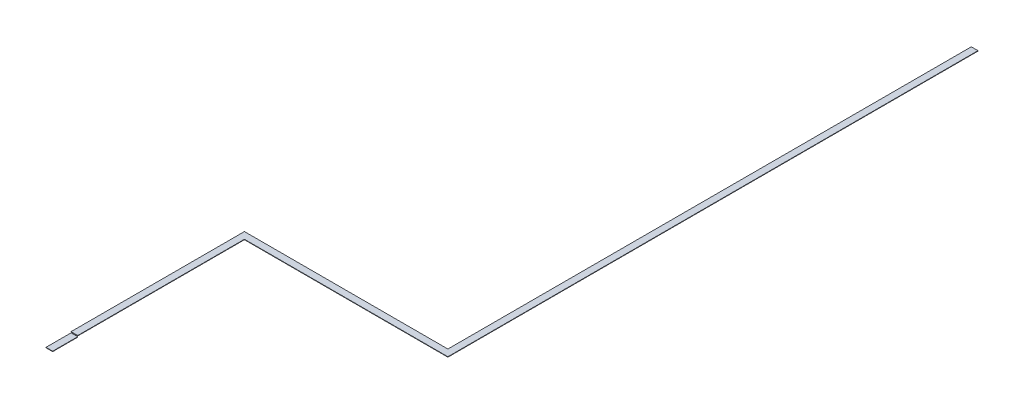
ISO-10303-21;
HEADER;
FILE_DESCRIPTION(('STEP AP214'),'2;1');
FILE_NAME('part.step','',(''),(''),'','','');
FILE_SCHEMA(('AUTOMOTIVE_DESIGN { 1 0 10303 214 1 1 1 1 }'));
ENDSEC;
DATA;
#1=APPLICATION_CONTEXT('core data for automotive mechanical design processes');
#2=APPLICATION_PROTOCOL_DEFINITION('international standard','automotive_design',2000,#1);
#3=PRODUCT_CONTEXT('',#1,'mechanical');
#4=PRODUCT('Part','Part','',(#3));
#5=PRODUCT_RELATED_PRODUCT_CATEGORY('part','',(#4));
#6=PRODUCT_DEFINITION_FORMATION('','',#4);
#7=PRODUCT_DEFINITION_CONTEXT('part definition',#1,'design');
#8=PRODUCT_DEFINITION('design','',#6,#7);
#9=PRODUCT_DEFINITION_SHAPE('','',#8);
#10=(LENGTH_UNIT() NAMED_UNIT(*) SI_UNIT(.MILLI.,.METRE.));
#11=(NAMED_UNIT(*) PLANE_ANGLE_UNIT() SI_UNIT($,.RADIAN.));
#12=(NAMED_UNIT(*) SI_UNIT($,.STERADIAN.) SOLID_ANGLE_UNIT());
#13=UNCERTAINTY_MEASURE_WITH_UNIT(LENGTH_MEASURE(1.E-05),#10,'distance_accuracy_value','');
#14=(GEOMETRIC_REPRESENTATION_CONTEXT(3) GLOBAL_UNCERTAINTY_ASSIGNED_CONTEXT((#13)) GLOBAL_UNIT_ASSIGNED_CONTEXT((#10,
#11,#12)) REPRESENTATION_CONTEXT('',''));
#15=CARTESIAN_POINT('',(0.,0.,0.));
#16=DIRECTION('',(0.,0.,1.));
#17=DIRECTION('',(1.,0.,0.));
#18=AXIS2_PLACEMENT_3D('',#15,#16,#17);
#19=CARTESIAN_POINT('',(0.,-7.9375,0.));
#20=DIRECTION('',(1.,0.,0.));
#21=DIRECTION('',(0.,0.,-1.));
#22=AXIS2_PLACEMENT_3D('',#19,#20,#21);
#23=PLANE('',#22);
#24=DIRECTION('',(0.,0.,-1.));
#25=VECTOR('',#24,1.);
#26=CARTESIAN_POINT('',(0.,-4.7625,0.));
#27=LINE('',#26,#25);
#28=CARTESIAN_POINT('',(0.,-4.7625,0.));
#29=VERTEX_POINT('',#28);
#30=CARTESIAN_POINT('',(0.,-4.7625,-190.5));
#31=VERTEX_POINT('',#30);
#32=EDGE_CURVE('E106',#29,#31,#27,.T.);
#33=ORIENTED_EDGE('',*,*,#32,.T.);
#34=DIRECTION('',(0.,1.,0.));
#35=VECTOR('',#34,1.);
#36=CARTESIAN_POINT('',(0.,-7.9375,-190.5));
#37=LINE('',#36,#35);
#38=CARTESIAN_POINT('',(0.,-7.9375,-190.5));
#39=VERTEX_POINT('',#38);
#40=EDGE_CURVE('E12',#39,#31,#37,.T.);
#41=ORIENTED_EDGE('',*,*,#40,.F.);
#42=DIRECTION('',(0.,0.,-1.));
#43=VECTOR('',#42,1.);
#44=CARTESIAN_POINT('',(0.,-7.9375,0.));
#45=LINE('',#44,#43);
#46=CARTESIAN_POINT('',(0.,-7.9375,0.));
#47=VERTEX_POINT('',#46);
#48=EDGE_CURVE('E94',#47,#39,#45,.T.);
#49=ORIENTED_EDGE('',*,*,#48,.F.);
#50=DIRECTION('',(0.,1.,0.));
#51=VECTOR('',#50,1.);
#52=CARTESIAN_POINT('',(0.,-7.9375,0.));
#53=LINE('',#52,#51);
#54=EDGE_CURVE('E102',#47,#29,#53,.T.);
#55=ORIENTED_EDGE('',*,*,#54,.T.);
#56=EDGE_LOOP('',(#33,#41,#49,#55));
#57=FACE_BOUND('',#56,.T.);
#58=ADVANCED_FACE('F43',(#57),#23,.F.);
#59=CARTESIAN_POINT('',(0.,-7.9375,-190.5));
#60=DIRECTION('',(0.,0.,1.));
#61=DIRECTION('',(1.,0.,0.));
#62=AXIS2_PLACEMENT_3D('',#59,#60,#61);
#63=PLANE('',#62);
#64=DIRECTION('',(1.,0.,0.));
#65=VECTOR('',#64,1.);
#66=CARTESIAN_POINT('',(0.,-4.7625,-190.5));
#67=LINE('',#66,#65);
#68=CARTESIAN_POINT('',(50.8000000000002,-4.7625,-190.5));
#69=VERTEX_POINT('',#68);
#70=EDGE_CURVE('E98',#31,#69,#67,.T.);
#71=ORIENTED_EDGE('',*,*,#70,.T.);
#72=DIRECTION('',(0.,1.,0.));
#73=VECTOR('',#72,1.);
#74=CARTESIAN_POINT('',(50.8000000000002,-7.9375,-190.5));
#75=LINE('',#74,#73);
#76=CARTESIAN_POINT('',(50.8000000000002,-7.9375,-190.5));
#77=VERTEX_POINT('',#76);
#78=EDGE_CURVE('E51',#77,#69,#75,.T.);
#79=ORIENTED_EDGE('',*,*,#78,.F.);
#80=DIRECTION('',(1.,0.,0.));
#81=VECTOR('',#80,1.);
#82=CARTESIAN_POINT('',(0.,-7.9375,-190.5));
#83=LINE('',#82,#81);
#84=EDGE_CURVE('E89',#39,#77,#83,.T.);
#85=ORIENTED_EDGE('',*,*,#84,.F.);
#86=ORIENTED_EDGE('',*,*,#40,.T.);
#87=EDGE_LOOP('',(#71,#79,#85,#86));
#88=FACE_BOUND('',#87,.T.);
#89=ADVANCED_FACE('F97',(#88),#63,.F.);
#90=CARTESIAN_POINT('',(50.8000000000002,-7.9375,0.));
#91=DIRECTION('',(-1.,0.,0.));
#92=DIRECTION('',(0.,0.,1.));
#93=AXIS2_PLACEMENT_3D('',#90,#91,#92);
#94=PLANE('',#93);
#95=DIRECTION('',(0.,0.,1.));
#96=VECTOR('',#95,1.);
#97=CARTESIAN_POINT('',(50.8000000000002,-4.7625,0.));
#98=LINE('',#97,#96);
#99=CARTESIAN_POINT('',(50.8000000000002,-4.7625,0.));
#100=VERTEX_POINT('',#99);
#101=EDGE_CURVE('E76',#69,#100,#98,.T.);
#102=ORIENTED_EDGE('',*,*,#101,.T.);
#103=DIRECTION('',(0.,1.,0.));
#104=VECTOR('',#103,1.);
#105=CARTESIAN_POINT('',(50.8000000000002,-7.9375,0.));
#106=LINE('',#105,#104);
#107=CARTESIAN_POINT('',(50.8000000000002,-7.9375,0.));
#108=VERTEX_POINT('',#107);
#109=EDGE_CURVE('E99',#108,#100,#106,.T.);
#110=ORIENTED_EDGE('',*,*,#109,.F.);
#111=DIRECTION('',(0.,0.,1.));
#112=VECTOR('',#111,1.);
#113=CARTESIAN_POINT('',(50.8000000000002,-7.9375,0.));
#114=LINE('',#113,#112);
#115=EDGE_CURVE('E92',#77,#108,#114,.T.);
#116=ORIENTED_EDGE('',*,*,#115,.F.);
#117=ORIENTED_EDGE('',*,*,#78,.T.);
#118=EDGE_LOOP('',(#102,#110,#116,#117));
#119=FACE_BOUND('',#118,.T.);
#120=ADVANCED_FACE('F100',(#119),#94,.F.);
#121=CARTESIAN_POINT('',(0.,-7.9375,0.));
#122=DIRECTION('',(0.,0.,-1.));
#123=DIRECTION('',(-1.,0.,0.));
#124=AXIS2_PLACEMENT_3D('',#121,#122,#123);
#125=PLANE('',#124);
#126=DIRECTION('',(-1.,0.,0.));
#127=VECTOR('',#126,1.);
#128=CARTESIAN_POINT('',(0.,-4.7625,0.));
#129=LINE('',#128,#127);
#130=EDGE_CURVE('E82',#100,#29,#129,.T.);
#131=ORIENTED_EDGE('',*,*,#130,.T.);
#132=ORIENTED_EDGE('',*,*,#54,.F.);
#133=DIRECTION('',(-1.,0.,0.));
#134=VECTOR('',#133,1.);
#135=CARTESIAN_POINT('',(0.,-7.9375,0.));
#136=LINE('',#135,#134);
#137=EDGE_CURVE('E59',#108,#47,#136,.T.);
#138=ORIENTED_EDGE('',*,*,#137,.F.);
#139=ORIENTED_EDGE('',*,*,#109,.T.);
#140=EDGE_LOOP('',(#131,#132,#138,#139));
#141=FACE_BOUND('',#140,.T.);
#142=ADVANCED_FACE('F113',(#141),#125,.F.);
#143=CARTESIAN_POINT('',(0.,-7.9375,0.));
#144=DIRECTION('',(0.,-1.,0.));
#145=DIRECTION('',(0.,0.,-1.));
#146=AXIS2_PLACEMENT_3D('',#143,#144,#145);
#147=PLANE('',#146);
#148=ORIENTED_EDGE('',*,*,#48,.T.);
#149=ORIENTED_EDGE('',*,*,#84,.T.);
#150=ORIENTED_EDGE('',*,*,#115,.T.);
#151=ORIENTED_EDGE('',*,*,#137,.T.);
#152=EDGE_LOOP('',(#148,#149,#150,#151));
#153=FACE_BOUND('',#152,.T.);
#154=ADVANCED_FACE('F90',(#153),#147,.T.);
#155=CARTESIAN_POINT('',(0.,-4.7625,0.));
#156=DIRECTION('',(0.,-1.,0.));
#157=DIRECTION('',(0.,0.,-1.));
#158=AXIS2_PLACEMENT_3D('',#155,#156,#157);
#159=PLANE('',#158);
#160=ORIENTED_EDGE('',*,*,#32,.F.);
#161=ORIENTED_EDGE('',*,*,#130,.F.);
#162=ORIENTED_EDGE('',*,*,#101,.F.);
#163=ORIENTED_EDGE('',*,*,#70,.F.);
#164=EDGE_LOOP('',(#160,#161,#162,#163));
#165=FACE_BOUND('',#164,.T.);
#166=ADVANCED_FACE('F116',(#165),#159,.F.);
#167=CLOSED_SHELL('',(#58,#89,#120,#142,#154,#166));
#168=MANIFOLD_SOLID_BREP('B2',#167);
#169=CARTESIAN_POINT('',(50.8,3.175,-1457.325));
#170=DIRECTION('',(-1.,0.,0.));
#171=DIRECTION('',(0.,0.,1.));
#172=AXIS2_PLACEMENT_3D('',#169,#170,#171);
#173=PLANE('',#172);
#174=DIRECTION('',(0.,0.,-1.));
#175=VECTOR('',#174,1.);
#176=CARTESIAN_POINT('',(50.8,3.175,-1457.325));
#177=LINE('',#176,#175);
#178=CARTESIAN_POINT('',(50.8000000000002,3.175,-190.5));
#179=VERTEX_POINT('',#178);
#180=CARTESIAN_POINT('',(50.8,3.175,-1457.325));
#181=VERTEX_POINT('',#180);
#182=EDGE_CURVE('E225',#179,#181,#177,.T.);
#183=ORIENTED_EDGE('',*,*,#182,.F.);
#184=DIRECTION('',(0.,1.,0.));
#185=VECTOR('',#184,1.);
#186=CARTESIAN_POINT('',(50.8000000000002,0.,-190.5));
#187=LINE('',#186,#185);
#188=CARTESIAN_POINT('',(50.8000000000002,0.,-190.5));
#189=VERTEX_POINT('',#188);
#190=EDGE_CURVE('E301',#189,#179,#187,.T.);
#191=ORIENTED_EDGE('',*,*,#190,.F.);
#192=DIRECTION('',(0.,0.,-1.));
#193=VECTOR('',#192,1.);
#194=CARTESIAN_POINT('',(50.8,0.,-1457.325));
#195=LINE('',#194,#193);
#196=CARTESIAN_POINT('',(50.8,0.,-1457.325));
#197=VERTEX_POINT('',#196);
#198=EDGE_CURVE('E266',#189,#197,#195,.T.);
#199=ORIENTED_EDGE('',*,*,#198,.T.);
#200=DIRECTION('',(0.,-1.,0.));
#201=VECTOR('',#200,1.);
#202=CARTESIAN_POINT('',(50.8,3.175,-1457.325));
#203=LINE('',#202,#201);
#204=EDGE_CURVE('E41',#181,#197,#203,.T.);
#205=ORIENTED_EDGE('',*,*,#204,.F.);
#206=EDGE_LOOP('',(#183,#191,#199,#205));
#207=FACE_BOUND('',#206,.T.);
#208=ADVANCED_FACE('F167',(#207),#173,.F.);
#209=CARTESIAN_POINT('',(1597.025,3.175,-1457.325));
#210=DIRECTION('',(0.,0.,-1.));
#211=DIRECTION('',(-1.,0.,0.));
#212=AXIS2_PLACEMENT_3D('',#209,#210,#211);
#213=PLANE('',#212);
#214=DIRECTION('',(1.,0.,0.));
#215=VECTOR('',#214,1.);
#216=CARTESIAN_POINT('',(1597.025,0.,-1457.325));
#217=LINE('',#216,#215);
#218=CARTESIAN_POINT('',(1597.025,0.,-1457.325));
#219=VERTEX_POINT('',#218);
#220=EDGE_CURVE('E268',#197,#219,#217,.T.);
#221=ORIENTED_EDGE('',*,*,#220,.T.);
#222=DIRECTION('',(0.,-1.,0.));
#223=VECTOR('',#222,1.);
#224=CARTESIAN_POINT('',(1597.025,3.175,-1457.325));
#225=LINE('',#224,#223);
#226=CARTESIAN_POINT('',(1597.025,3.175,-1457.325));
#227=VERTEX_POINT('',#226);
#228=EDGE_CURVE('E174',#227,#219,#225,.T.);
#229=ORIENTED_EDGE('',*,*,#228,.F.);
#230=DIRECTION('',(1.,0.,0.));
#231=VECTOR('',#230,1.);
#232=CARTESIAN_POINT('',(1597.025,3.175,-1457.325));
#233=LINE('',#232,#231);
#234=EDGE_CURVE('E311',#181,#227,#233,.T.);
#235=ORIENTED_EDGE('',*,*,#234,.F.);
#236=ORIENTED_EDGE('',*,*,#204,.T.);
#237=EDGE_LOOP('',(#221,#229,#235,#236));
#238=FACE_BOUND('',#237,.T.);
#239=ADVANCED_FACE('F313',(#238),#213,.F.);
#240=CARTESIAN_POINT('',(1597.025,3.175,-5486.39999999999));
#241=DIRECTION('',(-1.,0.,0.));
#242=DIRECTION('',(0.,0.,1.));
#243=AXIS2_PLACEMENT_3D('',#240,#241,#242);
#244=PLANE('',#243);
#245=DIRECTION('',(0.,0.,-1.));
#246=VECTOR('',#245,1.);
#247=CARTESIAN_POINT('',(1597.025,0.,-5486.39999999999));
#248=LINE('',#247,#246);
#249=CARTESIAN_POINT('',(1597.025,0.,-5486.39999999999));
#250=VERTEX_POINT('',#249);
#251=EDGE_CURVE('E270',#219,#250,#248,.T.);
#252=ORIENTED_EDGE('',*,*,#251,.T.);
#253=DIRECTION('',(0.,-1.,0.));
#254=VECTOR('',#253,1.);
#255=CARTESIAN_POINT('',(1597.025,3.175,-5486.39999999999));
#256=LINE('',#255,#254);
#257=CARTESIAN_POINT('',(1597.025,3.175,-5486.39999999999));
#258=VERTEX_POINT('',#257);
#259=EDGE_CURVE('E255',#258,#250,#256,.T.);
#260=ORIENTED_EDGE('',*,*,#259,.F.);
#261=DIRECTION('',(0.,0.,-1.));
#262=VECTOR('',#261,1.);
#263=CARTESIAN_POINT('',(1597.025,3.175,-5486.39999999999));
#264=LINE('',#263,#262);
#265=EDGE_CURVE('E243',#227,#258,#264,.T.);
#266=ORIENTED_EDGE('',*,*,#265,.F.);
#267=ORIENTED_EDGE('',*,*,#228,.T.);
#268=EDGE_LOOP('',(#252,#260,#266,#267));
#269=FACE_BOUND('',#268,.T.);
#270=ADVANCED_FACE('F285',(#269),#244,.F.);
#271=CARTESIAN_POINT('',(1546.225,3.175,-5486.39999999999));
#272=DIRECTION('',(0.,0.,1.));
#273=DIRECTION('',(1.,0.,0.));
#274=AXIS2_PLACEMENT_3D('',#271,#272,#273);
#275=PLANE('',#274);
#276=DIRECTION('',(-1.,0.,0.));
#277=VECTOR('',#276,1.);
#278=CARTESIAN_POINT('',(1546.225,0.,-5486.39999999999));
#279=LINE('',#278,#277);
#280=CARTESIAN_POINT('',(1546.225,0.,-5486.39999999999));
#281=VERTEX_POINT('',#280);
#282=EDGE_CURVE('E252',#250,#281,#279,.T.);
#283=ORIENTED_EDGE('',*,*,#282,.T.);
#284=DIRECTION('',(0.,-1.,0.));
#285=VECTOR('',#284,1.);
#286=CARTESIAN_POINT('',(1546.225,3.175,-5486.39999999999));
#287=LINE('',#286,#285);
#288=CARTESIAN_POINT('',(1546.225,3.175,-5486.39999999999));
#289=VERTEX_POINT('',#288);
#290=EDGE_CURVE('E249',#289,#281,#287,.T.);
#291=ORIENTED_EDGE('',*,*,#290,.F.);
#292=DIRECTION('',(-1.,0.,0.));
#293=VECTOR('',#292,1.);
#294=CARTESIAN_POINT('',(1546.225,3.175,-5486.39999999999));
#295=LINE('',#294,#293);
#296=EDGE_CURVE('E236',#258,#289,#295,.T.);
#297=ORIENTED_EDGE('',*,*,#296,.F.);
#298=ORIENTED_EDGE('',*,*,#259,.T.);
#299=EDGE_LOOP('',(#283,#291,#297,#298));
#300=FACE_BOUND('',#299,.T.);
#301=ADVANCED_FACE('F250',(#300),#275,.F.);
#302=CARTESIAN_POINT('',(1546.225,3.175,-1508.125));
#303=DIRECTION('',(1.,0.,0.));
#304=DIRECTION('',(0.,0.,-1.));
#305=AXIS2_PLACEMENT_3D('',#302,#303,#304);
#306=PLANE('',#305);
#307=DIRECTION('',(0.,0.,1.));
#308=VECTOR('',#307,1.);
#309=CARTESIAN_POINT('',(1546.225,0.,-1508.125));
#310=LINE('',#309,#308);
#311=CARTESIAN_POINT('',(1546.225,0.,-1508.125));
#312=VERTEX_POINT('',#311);
#313=EDGE_CURVE('E273',#281,#312,#310,.T.);
#314=ORIENTED_EDGE('',*,*,#313,.T.);
#315=DIRECTION('',(0.,-1.,0.));
#316=VECTOR('',#315,1.);
#317=CARTESIAN_POINT('',(1546.225,3.175,-1508.125));
#318=LINE('',#317,#316);
#319=CARTESIAN_POINT('',(1546.225,3.175,-1508.125));
#320=VERTEX_POINT('',#319);
#321=EDGE_CURVE('E256',#320,#312,#318,.T.);
#322=ORIENTED_EDGE('',*,*,#321,.F.);
#323=DIRECTION('',(0.,0.,1.));
#324=VECTOR('',#323,1.);
#325=CARTESIAN_POINT('',(1546.225,3.175,-1508.125));
#326=LINE('',#325,#324);
#327=EDGE_CURVE('E240',#289,#320,#326,.T.);
#328=ORIENTED_EDGE('',*,*,#327,.F.);
#329=ORIENTED_EDGE('',*,*,#290,.T.);
#330=EDGE_LOOP('',(#314,#322,#328,#329));
#331=FACE_BOUND('',#330,.T.);
#332=ADVANCED_FACE('F258',(#331),#306,.F.);
#333=CARTESIAN_POINT('',(0.,3.175,-1508.125));
#334=DIRECTION('',(0.,0.,1.));
#335=DIRECTION('',(1.,0.,0.));
#336=AXIS2_PLACEMENT_3D('',#333,#334,#335);
#337=PLANE('',#336);
#338=DIRECTION('',(-1.,0.,0.));
#339=VECTOR('',#338,1.);
#340=CARTESIAN_POINT('',(0.,0.,-1508.125));
#341=LINE('',#340,#339);
#342=CARTESIAN_POINT('',(0.,0.,-1508.125));
#343=VERTEX_POINT('',#342);
#344=EDGE_CURVE('E217',#312,#343,#341,.T.);
#345=ORIENTED_EDGE('',*,*,#344,.T.);
#346=DIRECTION('',(0.,-1.,0.));
#347=VECTOR('',#346,1.);
#348=CARTESIAN_POINT('',(0.,3.175,-1508.125));
#349=LINE('',#348,#347);
#350=CARTESIAN_POINT('',(0.,3.175,-1508.125));
#351=VERTEX_POINT('',#350);
#352=EDGE_CURVE('E265',#351,#343,#349,.T.);
#353=ORIENTED_EDGE('',*,*,#352,.F.);
#354=DIRECTION('',(-1.,0.,0.));
#355=VECTOR('',#354,1.);
#356=CARTESIAN_POINT('',(0.,3.175,-1508.125));
#357=LINE('',#356,#355);
#358=EDGE_CURVE('E190',#320,#351,#357,.T.);
#359=ORIENTED_EDGE('',*,*,#358,.F.);
#360=ORIENTED_EDGE('',*,*,#321,.T.);
#361=EDGE_LOOP('',(#345,#353,#359,#360));
#362=FACE_BOUND('',#361,.T.);
#363=ADVANCED_FACE('F292',(#362),#337,.F.);
#364=CARTESIAN_POINT('',(0.,3.175,0.));
#365=DIRECTION('',(1.,0.,0.));
#366=DIRECTION('',(0.,0.,-1.));
#367=AXIS2_PLACEMENT_3D('',#364,#365,#366);
#368=PLANE('',#367);
#369=DIRECTION('',(0.,0.,1.));
#370=VECTOR('',#369,1.);
#371=CARTESIAN_POINT('',(0.,0.,0.));
#372=LINE('',#371,#370);
#373=CARTESIAN_POINT('',(0.,0.,-190.5));
#374=VERTEX_POINT('',#373);
#375=EDGE_CURVE('E276',#343,#374,#372,.T.);
#376=ORIENTED_EDGE('',*,*,#375,.T.);
#377=DIRECTION('',(0.,1.,0.));
#378=VECTOR('',#377,1.);
#379=CARTESIAN_POINT('',(0.,0.,-190.5));
#380=LINE('',#379,#378);
#381=CARTESIAN_POINT('',(0.,3.175,-190.5));
#382=VERTEX_POINT('',#381);
#383=EDGE_CURVE('E181',#374,#382,#380,.T.);
#384=ORIENTED_EDGE('',*,*,#383,.T.);
#385=DIRECTION('',(0.,0.,1.));
#386=VECTOR('',#385,1.);
#387=CARTESIAN_POINT('',(0.,3.175,0.));
#388=LINE('',#387,#386);
#389=EDGE_CURVE('E260',#351,#382,#388,.T.);
#390=ORIENTED_EDGE('',*,*,#389,.F.);
#391=ORIENTED_EDGE('',*,*,#352,.T.);
#392=EDGE_LOOP('',(#376,#384,#390,#391));
#393=FACE_BOUND('',#392,.T.);
#394=ADVANCED_FACE('F295',(#393),#368,.F.);
#395=CARTESIAN_POINT('',(0.,3.175,0.));
#396=DIRECTION('',(0.,-1.,0.));
#397=DIRECTION('',(0.,0.,-1.));
#398=AXIS2_PLACEMENT_3D('',#395,#396,#397);
#399=PLANE('',#398);
#400=ORIENTED_EDGE('',*,*,#389,.T.);
#401=DIRECTION('',(-1.,0.,0.));
#402=VECTOR('',#401,1.);
#403=CARTESIAN_POINT('',(0.,3.175,-190.5));
#404=LINE('',#403,#402);
#405=EDGE_CURVE('E297',#179,#382,#404,.T.);
#406=ORIENTED_EDGE('',*,*,#405,.F.);
#407=ORIENTED_EDGE('',*,*,#182,.T.);
#408=ORIENTED_EDGE('',*,*,#234,.T.);
#409=ORIENTED_EDGE('',*,*,#265,.T.);
#410=ORIENTED_EDGE('',*,*,#296,.T.);
#411=ORIENTED_EDGE('',*,*,#327,.T.);
#412=ORIENTED_EDGE('',*,*,#358,.T.);
#413=EDGE_LOOP('',(#400,#406,#407,#408,#409,#410,#411,#412));
#414=FACE_BOUND('',#413,.T.);
#415=ADVANCED_FACE('F238',(#414),#399,.F.);
#416=CARTESIAN_POINT('',(0.,0.,0.));
#417=DIRECTION('',(0.,-1.,0.));
#418=DIRECTION('',(0.,0.,-1.));
#419=AXIS2_PLACEMENT_3D('',#416,#417,#418);
#420=PLANE('',#419);
#421=DIRECTION('',(-1.,0.,0.));
#422=VECTOR('',#421,1.);
#423=CARTESIAN_POINT('',(0.,0.,-190.5));
#424=LINE('',#423,#422);
#425=EDGE_CURVE('E303',#189,#374,#424,.T.);
#426=ORIENTED_EDGE('',*,*,#425,.T.);
#427=ORIENTED_EDGE('',*,*,#375,.F.);
#428=ORIENTED_EDGE('',*,*,#344,.F.);
#429=ORIENTED_EDGE('',*,*,#313,.F.);
#430=ORIENTED_EDGE('',*,*,#282,.F.);
#431=ORIENTED_EDGE('',*,*,#251,.F.);
#432=ORIENTED_EDGE('',*,*,#220,.F.);
#433=ORIENTED_EDGE('',*,*,#198,.F.);
#434=EDGE_LOOP('',(#426,#427,#428,#429,#430,#431,#432,#433));
#435=FACE_BOUND('',#434,.T.);
#436=ADVANCED_FACE('F289',(#435),#420,.T.);
#437=CARTESIAN_POINT('',(0.,0.,-190.5));
#438=DIRECTION('',(0.,0.,-1.));
#439=DIRECTION('',(-1.,0.,0.));
#440=AXIS2_PLACEMENT_3D('',#437,#438,#439);
#441=PLANE('',#440);
#442=ORIENTED_EDGE('',*,*,#405,.T.);
#443=ORIENTED_EDGE('',*,*,#383,.F.);
#444=ORIENTED_EDGE('',*,*,#425,.F.);
#445=ORIENTED_EDGE('',*,*,#190,.T.);
#446=EDGE_LOOP('',(#442,#443,#444,#445));
#447=FACE_BOUND('',#446,.T.);
#448=ADVANCED_FACE('F302',(#447),#441,.F.);
#449=CLOSED_SHELL('',(#208,#239,#270,#301,#332,#363,#394,#415,#436,#448));
#450=MANIFOLD_SOLID_BREP('B6',#449);
#451=ADVANCED_BREP_SHAPE_REPRESENTATION('',(#18,#168,#450),#14);
#452=SHAPE_DEFINITION_REPRESENTATION(#9,#451);
ENDSEC;
END-ISO-10303-21;
